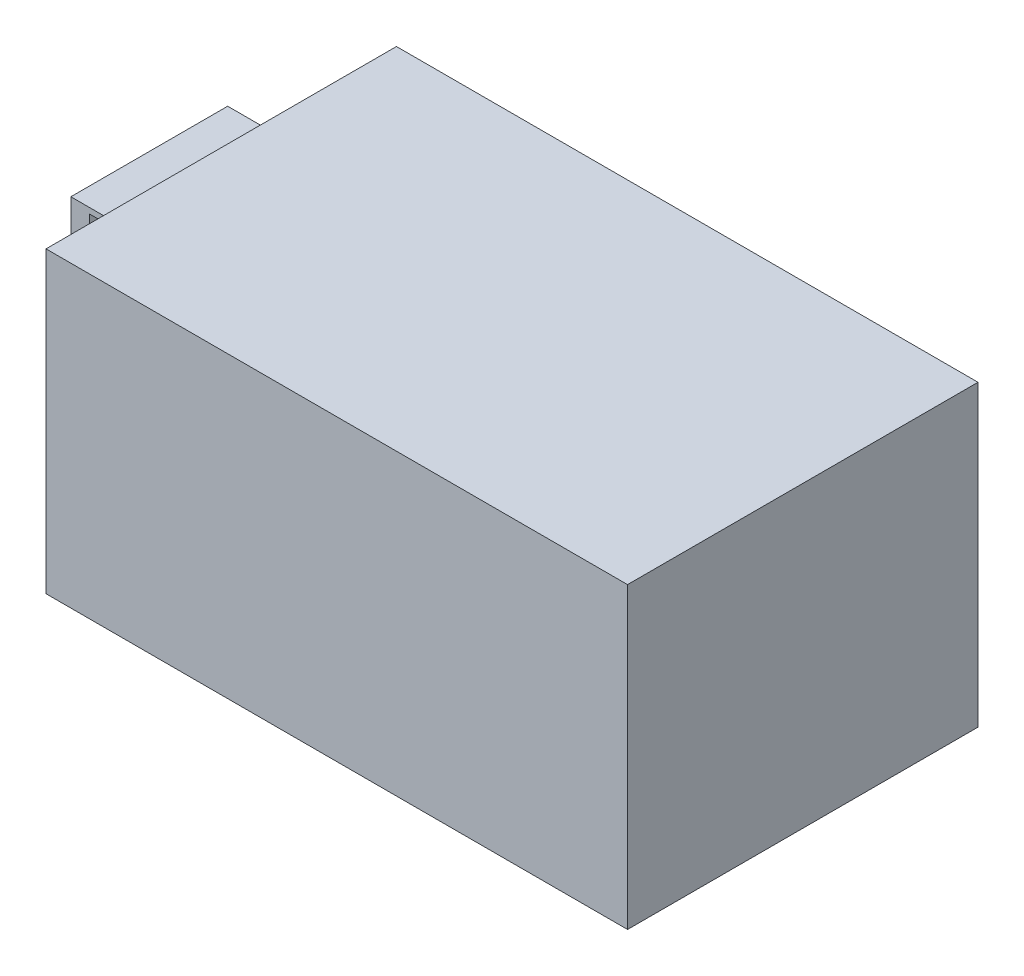
ISO-10303-21;
HEADER;
FILE_DESCRIPTION(('STEP AP214'),'2;1');
FILE_NAME('part.step','',(''),(''),'','','');
FILE_SCHEMA(('AUTOMOTIVE_DESIGN { 1 0 10303 214 1 1 1 1 }'));
ENDSEC;
DATA;
#1=APPLICATION_CONTEXT('core data for automotive mechanical design processes');
#2=APPLICATION_PROTOCOL_DEFINITION('international standard','automotive_design',2000,#1);
#3=PRODUCT_CONTEXT('',#1,'mechanical');
#4=PRODUCT('Part','Part','',(#3));
#5=PRODUCT_RELATED_PRODUCT_CATEGORY('part','',(#4));
#6=PRODUCT_DEFINITION_FORMATION('','',#4);
#7=PRODUCT_DEFINITION_CONTEXT('part definition',#1,'design');
#8=PRODUCT_DEFINITION('design','',#6,#7);
#9=PRODUCT_DEFINITION_SHAPE('','',#8);
#10=(LENGTH_UNIT() NAMED_UNIT(*) SI_UNIT(.MILLI.,.METRE.));
#11=(NAMED_UNIT(*) PLANE_ANGLE_UNIT() SI_UNIT($,.RADIAN.));
#12=(NAMED_UNIT(*) SI_UNIT($,.STERADIAN.) SOLID_ANGLE_UNIT());
#13=UNCERTAINTY_MEASURE_WITH_UNIT(LENGTH_MEASURE(1.E-05),#10,'distance_accuracy_value','');
#14=(GEOMETRIC_REPRESENTATION_CONTEXT(3) GLOBAL_UNCERTAINTY_ASSIGNED_CONTEXT((#13)) GLOBAL_UNIT_ASSIGNED_CONTEXT((#10,
#11,#12)) REPRESENTATION_CONTEXT('',''));
#15=CARTESIAN_POINT('',(0.,0.,0.));
#16=DIRECTION('',(0.,0.,1.));
#17=DIRECTION('',(1.,0.,0.));
#18=AXIS2_PLACEMENT_3D('',#15,#16,#17);
#19=CARTESIAN_POINT('',(-15.0905261181649,30.,-16.9550213929429));
#20=DIRECTION('',(-1.,0.,0.));
#21=DIRECTION('',(0.,0.,1.));
#22=AXIS2_PLACEMENT_3D('',#19,#20,#21);
#23=PLANE('',#22);
#24=DIRECTION('',(0.,-1.,0.));
#25=VECTOR('',#24,1.);
#26=CARTESIAN_POINT('',(-15.0905261181649,30.,4.04497860705709));
#27=LINE('',#26,#25);
#28=CARTESIAN_POINT('',(-15.0905261181649,30.,4.04497860705709));
#29=VERTEX_POINT('',#28);
#30=CARTESIAN_POINT('',(-15.0905261181649,29.25,4.04497860705709));
#31=VERTEX_POINT('',#30);
#32=EDGE_CURVE('E192',#29,#31,#27,.T.);
#33=ORIENTED_EDGE('',*,*,#32,.T.);
#34=DIRECTION('',(0.,0.,-1.));
#35=VECTOR('',#34,1.);
#36=CARTESIAN_POINT('',(-15.0905261181649,29.25,-16.9550213929429));
#37=LINE('',#36,#35);
#38=CARTESIAN_POINT('',(-15.0905261181649,29.25,-16.9550213929429));
#39=VERTEX_POINT('',#38);
#40=EDGE_CURVE('E157',#31,#39,#37,.T.);
#41=ORIENTED_EDGE('',*,*,#40,.T.);
#42=DIRECTION('',(0.,-1.,0.));
#43=VECTOR('',#42,1.);
#44=CARTESIAN_POINT('',(-15.0905261181649,30.,-16.9550213929429));
#45=LINE('',#44,#43);
#46=CARTESIAN_POINT('',(-15.0905261181649,30.,-16.9550213929429));
#47=VERTEX_POINT('',#46);
#48=EDGE_CURVE('E188',#47,#39,#45,.T.);
#49=ORIENTED_EDGE('',*,*,#48,.F.);
#50=DIRECTION('',(0.,0.,-1.));
#51=VECTOR('',#50,1.);
#52=CARTESIAN_POINT('',(-15.0905261181649,30.,-16.9550213929429));
#53=LINE('',#52,#51);
#54=EDGE_CURVE('E167',#29,#47,#53,.T.);
#55=ORIENTED_EDGE('',*,*,#54,.F.);
#56=EDGE_LOOP('',(#33,#41,#49,#55));
#57=FACE_BOUND('',#56,.T.);
#58=ADVANCED_FACE('F51',(#57),#23,.F.);
#59=CARTESIAN_POINT('',(-53.0905261181649,30.,-16.9550213929429));
#60=DIRECTION('',(1.,0.,0.));
#61=DIRECTION('',(0.,0.,-1.));
#62=AXIS2_PLACEMENT_3D('',#59,#60,#61);
#63=PLANE('',#62);
#64=DIRECTION('',(0.,0.,1.));
#65=VECTOR('',#64,1.);
#66=CARTESIAN_POINT('',(-53.0905261181649,0.,-16.9550213929429));
#67=LINE('',#66,#65);
#68=CARTESIAN_POINT('',(-53.0905261181649,0.,-16.9550213929429));
#69=VERTEX_POINT('',#68);
#70=CARTESIAN_POINT('',(-53.0905261181649,0.,4.04497860705709));
#71=VERTEX_POINT('',#70);
#72=EDGE_CURVE('E161',#69,#71,#67,.T.);
#73=ORIENTED_EDGE('',*,*,#72,.T.);
#74=DIRECTION('',(0.,-1.,0.));
#75=VECTOR('',#74,1.);
#76=CARTESIAN_POINT('',(-53.0905261181649,30.,4.04497860705709));
#77=LINE('',#76,#75);
#78=CARTESIAN_POINT('',(-53.0905261181649,30.,4.04497860705709));
#79=VERTEX_POINT('',#78);
#80=EDGE_CURVE('E196',#79,#71,#77,.T.);
#81=ORIENTED_EDGE('',*,*,#80,.F.);
#82=DIRECTION('',(0.,0.,1.));
#83=VECTOR('',#82,1.);
#84=CARTESIAN_POINT('',(-53.0905261181649,30.,-16.9550213929429));
#85=LINE('',#84,#83);
#86=CARTESIAN_POINT('',(-53.0905261181649,30.,-16.9550213929429));
#87=VERTEX_POINT('',#86);
#88=EDGE_CURVE('E162',#87,#79,#85,.T.);
#89=ORIENTED_EDGE('',*,*,#88,.F.);
#90=DIRECTION('',(0.,-1.,0.));
#91=VECTOR('',#90,1.);
#92=CARTESIAN_POINT('',(-53.0905261181649,30.,-16.9550213929429));
#93=LINE('',#92,#91);
#94=EDGE_CURVE('E172',#87,#69,#93,.T.);
#95=ORIENTED_EDGE('',*,*,#94,.T.);
#96=EDGE_LOOP('',(#73,#81,#89,#95));
#97=FACE_BOUND('',#96,.T.);
#98=ADVANCED_FACE('F53',(#97),#63,.F.);
#99=CARTESIAN_POINT('',(-53.0905261181649,30.,4.04497860705709));
#100=DIRECTION('',(0.,0.,-1.));
#101=DIRECTION('',(-1.,0.,0.));
#102=AXIS2_PLACEMENT_3D('',#99,#100,#101);
#103=PLANE('',#102);
#104=DIRECTION('',(0.,-1.,0.));
#105=VECTOR('',#104,1.);
#106=CARTESIAN_POINT('',(-50.5905261181649,29.25,4.04497860705709));
#107=LINE('',#106,#105);
#108=CARTESIAN_POINT('',(-50.5905261181649,29.25,4.04497860705709));
#109=VERTEX_POINT('',#108);
#110=CARTESIAN_POINT('',(-50.5905261181649,0.75,4.04497860705709));
#111=VERTEX_POINT('',#110);
#112=EDGE_CURVE('E137',#109,#111,#107,.T.);
#113=ORIENTED_EDGE('',*,*,#112,.F.);
#114=DIRECTION('',(-1.,0.,0.));
#115=VECTOR('',#114,1.);
#116=CARTESIAN_POINT('',(-50.5905261181649,29.25,4.04497860705709));
#117=LINE('',#116,#115);
#118=EDGE_CURVE('E134',#31,#109,#117,.T.);
#119=ORIENTED_EDGE('',*,*,#118,.F.);
#120=ORIENTED_EDGE('',*,*,#32,.F.);
#121=DIRECTION('',(1.,0.,0.));
#122=VECTOR('',#121,1.);
#123=CARTESIAN_POINT('',(-53.0905261181649,30.,4.04497860705709));
#124=LINE('',#123,#122);
#125=EDGE_CURVE('E104',#79,#29,#124,.T.);
#126=ORIENTED_EDGE('',*,*,#125,.F.);
#127=ORIENTED_EDGE('',*,*,#80,.T.);
#128=DIRECTION('',(1.,0.,0.));
#129=VECTOR('',#128,1.);
#130=CARTESIAN_POINT('',(-53.0905261181649,0.,4.04497860705709));
#131=LINE('',#130,#129);
#132=CARTESIAN_POINT('',(-15.0905261181649,0.,4.04497860705709));
#133=VERTEX_POINT('',#132);
#134=EDGE_CURVE('E176',#71,#133,#131,.T.);
#135=ORIENTED_EDGE('',*,*,#134,.T.);
#136=CARTESIAN_POINT('',(-15.0905261181649,0.75,4.04497860705709));
#137=VERTEX_POINT('',#136);
#138=EDGE_CURVE('E147',#137,#133,#27,.T.);
#139=ORIENTED_EDGE('',*,*,#138,.F.);
#140=DIRECTION('',(1.,0.,0.));
#141=VECTOR('',#140,1.);
#142=CARTESIAN_POINT('',(-50.5905261181649,0.75,4.04497860705709));
#143=LINE('',#142,#141);
#144=EDGE_CURVE('E128',#111,#137,#143,.T.);
#145=ORIENTED_EDGE('',*,*,#144,.F.);
#146=EDGE_LOOP('',(#113,#119,#120,#126,#127,#135,#139,#145));
#147=FACE_BOUND('',#146,.T.);
#148=ADVANCED_FACE('F145',(#147),#103,.F.);
#149=CARTESIAN_POINT('',(-15.0905261181649,0.750000000000001,-16.9550213929429));
#150=VERTEX_POINT('',#149);
#151=CARTESIAN_POINT('',(-15.0905261181649,0.,-16.9550213929429));
#152=VERTEX_POINT('',#151);
#153=EDGE_CURVE('E187',#150,#152,#45,.T.);
#154=ORIENTED_EDGE('',*,*,#153,.F.);
#155=DIRECTION('',(0.,0.,1.));
#156=VECTOR('',#155,1.);
#157=CARTESIAN_POINT('',(-15.0905261181649,0.750000000000001,-16.9550213929429));
#158=LINE('',#157,#156);
#159=EDGE_CURVE('E67',#150,#137,#158,.T.);
#160=ORIENTED_EDGE('',*,*,#159,.T.);
#161=ORIENTED_EDGE('',*,*,#138,.T.);
#162=DIRECTION('',(0.,0.,-1.));
#163=VECTOR('',#162,1.);
#164=CARTESIAN_POINT('',(-15.0905261181649,0.,-16.9550213929429));
#165=LINE('',#164,#163);
#166=EDGE_CURVE('E179',#133,#152,#165,.T.);
#167=ORIENTED_EDGE('',*,*,#166,.T.);
#168=EDGE_LOOP('',(#154,#160,#161,#167));
#169=FACE_BOUND('',#168,.T.);
#170=ADVANCED_FACE('F217',(#169),#23,.F.);
#171=CARTESIAN_POINT('',(-53.0905261181649,30.,-16.9550213929429));
#172=DIRECTION('',(0.,0.,1.));
#173=DIRECTION('',(1.,0.,0.));
#174=AXIS2_PLACEMENT_3D('',#171,#172,#173);
#175=PLANE('',#174);
#176=ORIENTED_EDGE('',*,*,#48,.T.);
#177=DIRECTION('',(-1.,0.,0.));
#178=VECTOR('',#177,1.);
#179=CARTESIAN_POINT('',(-53.0905261181649,29.25,-16.9550213929429));
#180=LINE('',#179,#178);
#181=CARTESIAN_POINT('',(-50.5905261181649,29.25,-16.9550213929429));
#182=VERTEX_POINT('',#181);
#183=EDGE_CURVE('E12',#39,#182,#180,.T.);
#184=ORIENTED_EDGE('',*,*,#183,.T.);
#185=DIRECTION('',(0.,-1.,0.));
#186=VECTOR('',#185,1.);
#187=CARTESIAN_POINT('',(-50.5905261181649,30.,-16.9550213929429));
#188=LINE('',#187,#186);
#189=CARTESIAN_POINT('',(-50.5905261181649,0.75,-16.9550213929429));
#190=VERTEX_POINT('',#189);
#191=EDGE_CURVE('E60',#182,#190,#188,.T.);
#192=ORIENTED_EDGE('',*,*,#191,.T.);
#193=DIRECTION('',(1.,0.,0.));
#194=VECTOR('',#193,1.);
#195=CARTESIAN_POINT('',(-53.0905261181649,0.750000000000001,-16.9550213929429));
#196=LINE('',#195,#194);
#197=EDGE_CURVE('E129',#190,#150,#196,.T.);
#198=ORIENTED_EDGE('',*,*,#197,.T.);
#199=ORIENTED_EDGE('',*,*,#153,.T.);
#200=DIRECTION('',(-1.,0.,0.));
#201=VECTOR('',#200,1.);
#202=CARTESIAN_POINT('',(-53.0905261181649,0.,-16.9550213929429));
#203=LINE('',#202,#201);
#204=EDGE_CURVE('E96',#152,#69,#203,.T.);
#205=ORIENTED_EDGE('',*,*,#204,.T.);
#206=ORIENTED_EDGE('',*,*,#94,.F.);
#207=DIRECTION('',(-1.,0.,0.));
#208=VECTOR('',#207,1.);
#209=CARTESIAN_POINT('',(-53.0905261181649,30.,-16.9550213929429));
#210=LINE('',#209,#208);
#211=EDGE_CURVE('E76',#47,#87,#210,.T.);
#212=ORIENTED_EDGE('',*,*,#211,.F.);
#213=EDGE_LOOP('',(#176,#184,#192,#198,#199,#205,#206,#212));
#214=FACE_BOUND('',#213,.T.);
#215=ADVANCED_FACE('F201',(#214),#175,.F.);
#216=CARTESIAN_POINT('',(0.,30.,0.));
#217=DIRECTION('',(0.,1.,0.));
#218=DIRECTION('',(0.,0.,1.));
#219=AXIS2_PLACEMENT_3D('',#216,#217,#218);
#220=PLANE('',#219);
#221=ORIENTED_EDGE('',*,*,#88,.T.);
#222=ORIENTED_EDGE('',*,*,#125,.T.);
#223=ORIENTED_EDGE('',*,*,#54,.T.);
#224=ORIENTED_EDGE('',*,*,#211,.T.);
#225=EDGE_LOOP('',(#221,#222,#223,#224));
#226=FACE_BOUND('',#225,.T.);
#227=ADVANCED_FACE('F208',(#226),#220,.T.);
#228=CARTESIAN_POINT('',(0.,0.,0.));
#229=DIRECTION('',(0.,1.,0.));
#230=DIRECTION('',(0.,0.,1.));
#231=AXIS2_PLACEMENT_3D('',#228,#229,#230);
#232=PLANE('',#231);
#233=ORIENTED_EDGE('',*,*,#72,.F.);
#234=ORIENTED_EDGE('',*,*,#204,.F.);
#235=ORIENTED_EDGE('',*,*,#166,.F.);
#236=ORIENTED_EDGE('',*,*,#134,.F.);
#237=EDGE_LOOP('',(#233,#234,#235,#236));
#238=FACE_BOUND('',#237,.T.);
#239=ADVANCED_FACE('F215',(#238),#232,.F.);
#240=CARTESIAN_POINT('',(-50.5905261181649,29.25,-45.9550213929429));
#241=DIRECTION('',(-1.,0.,0.));
#242=DIRECTION('',(0.,0.,1.));
#243=AXIS2_PLACEMENT_3D('',#240,#241,#242);
#244=PLANE('',#243);
#245=DIRECTION('',(0.,0.,1.));
#246=VECTOR('',#245,1.);
#247=CARTESIAN_POINT('',(-50.5905261181649,29.25,-45.9550213929429));
#248=LINE('',#247,#246);
#249=EDGE_CURVE('E133',#182,#109,#248,.T.);
#250=ORIENTED_EDGE('',*,*,#249,.T.);
#251=ORIENTED_EDGE('',*,*,#112,.T.);
#252=DIRECTION('',(0.,0.,1.));
#253=VECTOR('',#252,1.);
#254=CARTESIAN_POINT('',(-50.5905261181649,0.75,-45.9550213929429));
#255=LINE('',#254,#253);
#256=EDGE_CURVE('E124',#190,#111,#255,.T.);
#257=ORIENTED_EDGE('',*,*,#256,.F.);
#258=ORIENTED_EDGE('',*,*,#191,.F.);
#259=EDGE_LOOP('',(#250,#251,#257,#258));
#260=FACE_BOUND('',#259,.T.);
#261=ADVANCED_FACE('F138',(#260),#244,.F.);
#262=CARTESIAN_POINT('',(-50.5905261181649,29.25,-45.9550213929429));
#263=DIRECTION('',(0.,1.,0.));
#264=DIRECTION('',(0.,0.,1.));
#265=AXIS2_PLACEMENT_3D('',#262,#263,#264);
#266=PLANE('',#265);
#267=ORIENTED_EDGE('',*,*,#118,.T.);
#268=ORIENTED_EDGE('',*,*,#249,.F.);
#269=ORIENTED_EDGE('',*,*,#183,.F.);
#270=ORIENTED_EDGE('',*,*,#40,.F.);
#271=EDGE_LOOP('',(#267,#268,#269,#270));
#272=FACE_BOUND('',#271,.T.);
#273=ADVANCED_FACE('F204',(#272),#266,.F.);
#274=CARTESIAN_POINT('',(-50.5905261181649,0.75,-45.9550213929429));
#275=DIRECTION('',(0.,-1.,0.));
#276=DIRECTION('',(0.,0.,-1.));
#277=AXIS2_PLACEMENT_3D('',#274,#275,#276);
#278=PLANE('',#277);
#279=ORIENTED_EDGE('',*,*,#197,.F.);
#280=ORIENTED_EDGE('',*,*,#256,.T.);
#281=ORIENTED_EDGE('',*,*,#144,.T.);
#282=ORIENTED_EDGE('',*,*,#159,.F.);
#283=EDGE_LOOP('',(#279,#280,#281,#282));
#284=FACE_BOUND('',#283,.T.);
#285=ADVANCED_FACE('F126',(#284),#278,.F.);
#286=CLOSED_SHELL('',(#58,#98,#148,#170,#215,#227,#239,#261,#273,#285));
#287=MANIFOLD_SOLID_BREP('B2',#286);
#288=CARTESIAN_POINT('',(-38.7115490486563,40.,-25.1796358856304));
#289=DIRECTION('',(1.,0.,0.));
#290=DIRECTION('',(0.,0.,-1.));
#291=AXIS2_PLACEMENT_3D('',#288,#289,#290);
#292=PLANE('',#291);
#293=DIRECTION('',(0.,0.,1.));
#294=VECTOR('',#293,1.);
#295=CARTESIAN_POINT('',(-38.7115490486563,0.,-25.1796358856304));
#296=LINE('',#295,#294);
#297=CARTESIAN_POINT('',(-38.7115490486563,0.,-25.1796358856304));
#298=VERTEX_POINT('',#297);
#299=CARTESIAN_POINT('',(-38.7115490486563,0.,21.7538350848644));
#300=VERTEX_POINT('',#299);
#301=EDGE_CURVE('E363',#298,#300,#296,.T.);
#302=ORIENTED_EDGE('',*,*,#301,.T.);
#303=DIRECTION('',(0.,-1.,0.));
#304=VECTOR('',#303,1.);
#305=CARTESIAN_POINT('',(-38.7115490486563,40.,21.7538350848644));
#306=LINE('',#305,#304);
#307=CARTESIAN_POINT('',(-38.7115490486563,40.,21.7538350848644));
#308=VERTEX_POINT('',#307);
#309=EDGE_CURVE('E49',#308,#300,#306,.T.);
#310=ORIENTED_EDGE('',*,*,#309,.F.);
#311=DIRECTION('',(0.,0.,1.));
#312=VECTOR('',#311,1.);
#313=CARTESIAN_POINT('',(-38.7115490486563,40.,-25.1796358856304));
#314=LINE('',#313,#312);
#315=CARTESIAN_POINT('',(-38.7115490486563,40.,-25.1796358856304));
#316=VERTEX_POINT('',#315);
#317=EDGE_CURVE('E351',#316,#308,#314,.T.);
#318=ORIENTED_EDGE('',*,*,#317,.F.);
#319=DIRECTION('',(0.,-1.,0.));
#320=VECTOR('',#319,1.);
#321=CARTESIAN_POINT('',(-38.7115490486563,40.,-25.1796358856304));
#322=LINE('',#321,#320);
#323=EDGE_CURVE('E359',#316,#298,#322,.T.);
#324=ORIENTED_EDGE('',*,*,#323,.T.);
#325=EDGE_LOOP('',(#302,#310,#318,#324));
#326=FACE_BOUND('',#325,.T.);
#327=ADVANCED_FACE('F300',(#326),#292,.F.);
#328=CARTESIAN_POINT('',(-38.7115490486563,40.,21.7538350848644));
#329=DIRECTION('',(0.,0.,-1.));
#330=DIRECTION('',(-1.,0.,0.));
#331=AXIS2_PLACEMENT_3D('',#328,#329,#330);
#332=PLANE('',#331);
#333=DIRECTION('',(1.,0.,0.));
#334=VECTOR('',#333,1.);
#335=CARTESIAN_POINT('',(-38.7115490486563,0.,21.7538350848644));
#336=LINE('',#335,#334);
#337=CARTESIAN_POINT('',(39.1683224887584,0.,21.7538350848644));
#338=VERTEX_POINT('',#337);
#339=EDGE_CURVE('E355',#300,#338,#336,.T.);
#340=ORIENTED_EDGE('',*,*,#339,.T.);
#341=DIRECTION('',(0.,-1.,0.));
#342=VECTOR('',#341,1.);
#343=CARTESIAN_POINT('',(39.1683224887584,40.,21.7538350848644));
#344=LINE('',#343,#342);
#345=CARTESIAN_POINT('',(39.1683224887584,40.,21.7538350848644));
#346=VERTEX_POINT('',#345);
#347=EDGE_CURVE('E308',#346,#338,#344,.T.);
#348=ORIENTED_EDGE('',*,*,#347,.F.);
#349=DIRECTION('',(1.,0.,0.));
#350=VECTOR('',#349,1.);
#351=CARTESIAN_POINT('',(-38.7115490486563,40.,21.7538350848644));
#352=LINE('',#351,#350);
#353=EDGE_CURVE('E346',#308,#346,#352,.T.);
#354=ORIENTED_EDGE('',*,*,#353,.F.);
#355=ORIENTED_EDGE('',*,*,#309,.T.);
#356=EDGE_LOOP('',(#340,#348,#354,#355));
#357=FACE_BOUND('',#356,.T.);
#358=ADVANCED_FACE('F354',(#357),#332,.F.);
#359=CARTESIAN_POINT('',(39.1683224887584,40.,-25.1796358856304));
#360=DIRECTION('',(-1.,0.,0.));
#361=DIRECTION('',(0.,0.,1.));
#362=AXIS2_PLACEMENT_3D('',#359,#360,#361);
#363=PLANE('',#362);
#364=DIRECTION('',(0.,0.,-1.));
#365=VECTOR('',#364,1.);
#366=CARTESIAN_POINT('',(39.1683224887584,0.,-25.1796358856304));
#367=LINE('',#366,#365);
#368=CARTESIAN_POINT('',(39.1683224887584,0.,-25.1796358856304));
#369=VERTEX_POINT('',#368);
#370=EDGE_CURVE('E333',#338,#369,#367,.T.);
#371=ORIENTED_EDGE('',*,*,#370,.T.);
#372=DIRECTION('',(0.,-1.,0.));
#373=VECTOR('',#372,1.);
#374=CARTESIAN_POINT('',(39.1683224887584,40.,-25.1796358856304));
#375=LINE('',#374,#373);
#376=CARTESIAN_POINT('',(39.1683224887584,40.,-25.1796358856304));
#377=VERTEX_POINT('',#376);
#378=EDGE_CURVE('E356',#377,#369,#375,.T.);
#379=ORIENTED_EDGE('',*,*,#378,.F.);
#380=DIRECTION('',(0.,0.,-1.));
#381=VECTOR('',#380,1.);
#382=CARTESIAN_POINT('',(39.1683224887584,40.,-25.1796358856304));
#383=LINE('',#382,#381);
#384=EDGE_CURVE('E349',#346,#377,#383,.T.);
#385=ORIENTED_EDGE('',*,*,#384,.F.);
#386=ORIENTED_EDGE('',*,*,#347,.T.);
#387=EDGE_LOOP('',(#371,#379,#385,#386));
#388=FACE_BOUND('',#387,.T.);
#389=ADVANCED_FACE('F357',(#388),#363,.F.);
#390=CARTESIAN_POINT('',(-38.7115490486563,40.,-25.1796358856304));
#391=DIRECTION('',(0.,0.,1.));
#392=DIRECTION('',(1.,0.,0.));
#393=AXIS2_PLACEMENT_3D('',#390,#391,#392);
#394=PLANE('',#393);
#395=DIRECTION('',(-1.,0.,0.));
#396=VECTOR('',#395,1.);
#397=CARTESIAN_POINT('',(-38.7115490486563,0.,-25.1796358856304));
#398=LINE('',#397,#396);
#399=EDGE_CURVE('E339',#369,#298,#398,.T.);
#400=ORIENTED_EDGE('',*,*,#399,.T.);
#401=ORIENTED_EDGE('',*,*,#323,.F.);
#402=DIRECTION('',(-1.,0.,0.));
#403=VECTOR('',#402,1.);
#404=CARTESIAN_POINT('',(-38.7115490486563,40.,-25.1796358856304));
#405=LINE('',#404,#403);
#406=EDGE_CURVE('E316',#377,#316,#405,.T.);
#407=ORIENTED_EDGE('',*,*,#406,.F.);
#408=ORIENTED_EDGE('',*,*,#378,.T.);
#409=EDGE_LOOP('',(#400,#401,#407,#408));
#410=FACE_BOUND('',#409,.T.);
#411=ADVANCED_FACE('F370',(#410),#394,.F.);
#412=CARTESIAN_POINT('',(0.,40.,0.));
#413=DIRECTION('',(0.,1.,0.));
#414=DIRECTION('',(0.,0.,1.));
#415=AXIS2_PLACEMENT_3D('',#412,#413,#414);
#416=PLANE('',#415);
#417=ORIENTED_EDGE('',*,*,#317,.T.);
#418=ORIENTED_EDGE('',*,*,#353,.T.);
#419=ORIENTED_EDGE('',*,*,#384,.T.);
#420=ORIENTED_EDGE('',*,*,#406,.T.);
#421=EDGE_LOOP('',(#417,#418,#419,#420));
#422=FACE_BOUND('',#421,.T.);
#423=ADVANCED_FACE('F347',(#422),#416,.T.);
#424=CARTESIAN_POINT('',(0.,0.,0.));
#425=DIRECTION('',(0.,1.,0.));
#426=DIRECTION('',(0.,0.,1.));
#427=AXIS2_PLACEMENT_3D('',#424,#425,#426);
#428=PLANE('',#427);
#429=ORIENTED_EDGE('',*,*,#301,.F.);
#430=ORIENTED_EDGE('',*,*,#399,.F.);
#431=ORIENTED_EDGE('',*,*,#370,.F.);
#432=ORIENTED_EDGE('',*,*,#339,.F.);
#433=EDGE_LOOP('',(#429,#430,#431,#432));
#434=FACE_BOUND('',#433,.T.);
#435=ADVANCED_FACE('F373',(#434),#428,.F.);
#436=CLOSED_SHELL('',(#327,#358,#389,#411,#423,#435));
#437=MANIFOLD_SOLID_BREP('B6_NOT_SHOWN',#436);
#438=ADVANCED_BREP_SHAPE_REPRESENTATION('',(#18,#287,#437),#14);
#439=SHAPE_DEFINITION_REPRESENTATION(#9,#438);
ENDSEC;
END-ISO-10303-21;
